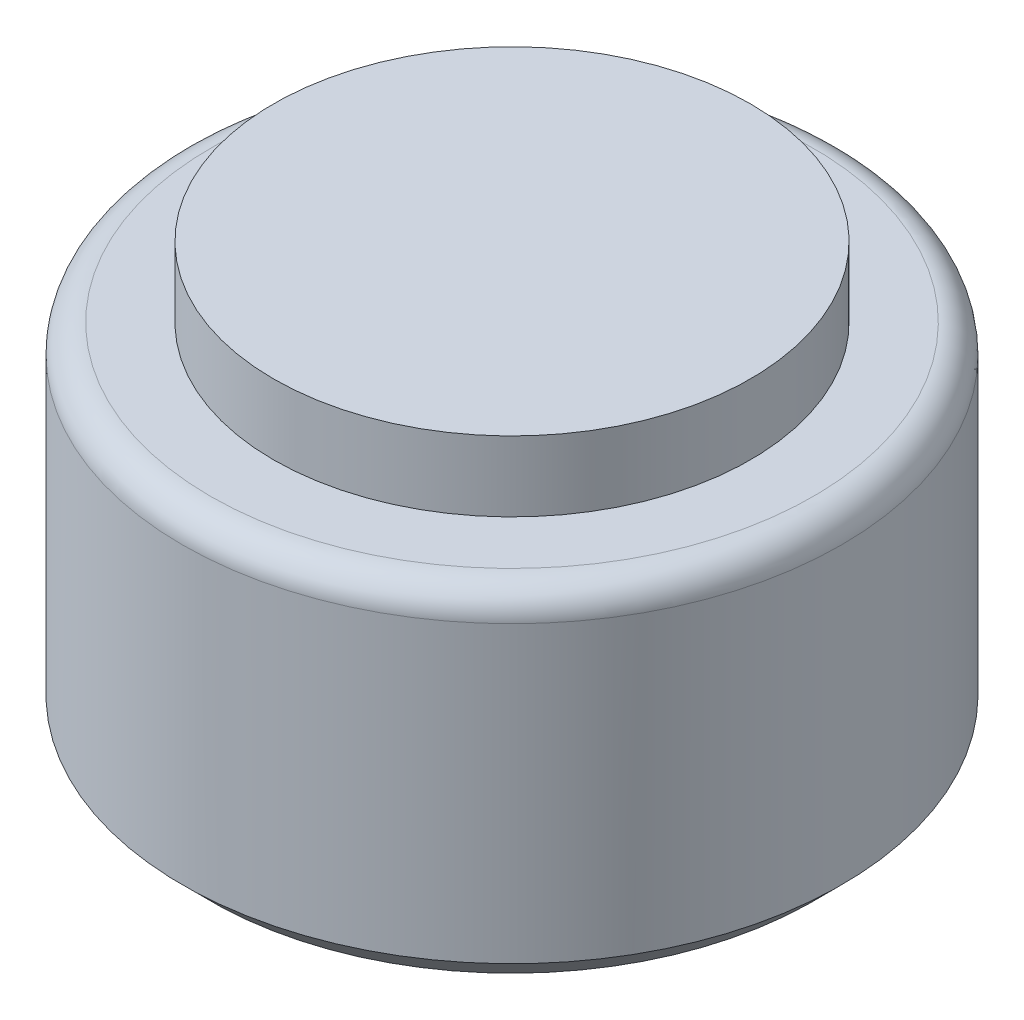
ISO-10303-21;
HEADER;
FILE_DESCRIPTION(('STEP AP214'),'2;1');
FILE_NAME('part.step','',(''),(''),'','','');
FILE_SCHEMA(('AUTOMOTIVE_DESIGN { 1 0 10303 214 1 1 1 1 }'));
ENDSEC;
DATA;
#1=APPLICATION_CONTEXT('core data for automotive mechanical design processes');
#2=APPLICATION_PROTOCOL_DEFINITION('international standard','automotive_design',2000,#1);
#3=PRODUCT_CONTEXT('',#1,'mechanical');
#4=PRODUCT('Part','Part','',(#3));
#5=PRODUCT_RELATED_PRODUCT_CATEGORY('part','',(#4));
#6=PRODUCT_DEFINITION_FORMATION('','',#4);
#7=PRODUCT_DEFINITION_CONTEXT('part definition',#1,'design');
#8=PRODUCT_DEFINITION('design','',#6,#7);
#9=PRODUCT_DEFINITION_SHAPE('','',#8);
#10=(LENGTH_UNIT() NAMED_UNIT(*) SI_UNIT(.MILLI.,.METRE.));
#11=(NAMED_UNIT(*) PLANE_ANGLE_UNIT() SI_UNIT($,.RADIAN.));
#12=(NAMED_UNIT(*) SI_UNIT($,.STERADIAN.) SOLID_ANGLE_UNIT());
#13=UNCERTAINTY_MEASURE_WITH_UNIT(LENGTH_MEASURE(1.E-05),#10,'distance_accuracy_value','');
#14=(GEOMETRIC_REPRESENTATION_CONTEXT(3) GLOBAL_UNCERTAINTY_ASSIGNED_CONTEXT((#13)) GLOBAL_UNIT_ASSIGNED_CONTEXT((#10,
#11,#12)) REPRESENTATION_CONTEXT('',''));
#15=CARTESIAN_POINT('',(0.,0.,0.));
#16=DIRECTION('',(0.,0.,1.));
#17=DIRECTION('',(1.,0.,0.));
#18=AXIS2_PLACEMENT_3D('',#15,#16,#17);
#19=CARTESIAN_POINT('',(0.,0.,0.));
#20=DIRECTION('',(0.,1.,0.));
#21=DIRECTION('',(0.,0.,1.));
#22=AXIS2_PLACEMENT_3D('',#19,#20,#21);
#23=PLANE('',#22);
#24=CARTESIAN_POINT('',(0.,0.,0.));
#25=DIRECTION('',(0.,-1.,0.));
#26=DIRECTION('',(0.,0.,-1.));
#27=AXIS2_PLACEMENT_3D('',#24,#25,#26);
#28=CIRCLE('',#27,85.);
#29=CARTESIAN_POINT('',(0.,0.,-85.));
#30=VERTEX_POINT('',#29);
#31=EDGE_CURVE('E71',#30,#30,#28,.T.);
#32=ORIENTED_EDGE('',*,*,#31,.F.);
#33=EDGE_LOOP('',(#32));
#34=FACE_BOUND('',#33,.T.);
#35=ADVANCED_FACE('F37',(#34),#23,.T.);
#36=CARTESIAN_POINT('',(0.,0.,0.));
#37=DIRECTION('',(0.,-1.,0.));
#38=DIRECTION('',(0.,0.,-1.));
#39=AXIS2_PLACEMENT_3D('',#36,#37,#38);
#40=CYLINDRICAL_SURFACE('',#39,85.);
#41=ORIENTED_EDGE('',*,*,#31,.T.);
#42=EDGE_LOOP('',(#41));
#43=FACE_BOUND('',#42,.T.);
#44=CARTESIAN_POINT('',(0.,-25.,0.));
#45=DIRECTION('',(0.,-1.,0.));
#46=DIRECTION('',(0.,0.,-1.));
#47=AXIS2_PLACEMENT_3D('',#44,#45,#46);
#48=CIRCLE('',#47,85.);
#49=CARTESIAN_POINT('',(0.,-25.,-85.));
#50=VERTEX_POINT('',#49);
#51=EDGE_CURVE('E68',#50,#50,#48,.T.);
#52=ORIENTED_EDGE('',*,*,#51,.F.);
#53=EDGE_LOOP('',(#52));
#54=FACE_BOUND('',#53,.T.);
#55=ADVANCED_FACE('F94',(#43,#54),#40,.T.);
#56=CARTESIAN_POINT('',(85.,-25.,0.));
#57=DIRECTION('',(0.,1.,0.));
#58=DIRECTION('',(0.,0.,1.));
#59=AXIS2_PLACEMENT_3D('',#56,#57,#58);
#60=PLANE('',#59);
#61=CARTESIAN_POINT('',(0.,-25.,0.));
#62=DIRECTION('',(0.,1.,0.));
#63=DIRECTION('',(0.,0.,1.));
#64=AXIS2_PLACEMENT_3D('',#61,#62,#63);
#65=CIRCLE('',#64,107.5);
#66=CARTESIAN_POINT('',(0.,-25.,107.5));
#67=VERTEX_POINT('',#66);
#68=EDGE_CURVE('E11',#67,#67,#65,.T.);
#69=ORIENTED_EDGE('',*,*,#68,.T.);
#70=EDGE_LOOP('',(#69));
#71=FACE_BOUND('',#70,.T.);
#72=ORIENTED_EDGE('',*,*,#51,.T.);
#73=EDGE_LOOP('',(#72));
#74=FACE_BOUND('',#73,.T.);
#75=ADVANCED_FACE('F100',(#71,#74),#60,.T.);
#76=CARTESIAN_POINT('',(0.,0.,0.));
#77=DIRECTION('',(0.,-1.,0.));
#78=DIRECTION('',(0.,0.,-1.));
#79=AXIS2_PLACEMENT_3D('',#76,#77,#78);
#80=CYLINDRICAL_SURFACE('',#79,117.5);
#81=CARTESIAN_POINT('',(0.,-35.,0.));
#82=DIRECTION('',(0.,1.,0.));
#83=DIRECTION('',(0.,0.,1.));
#84=AXIS2_PLACEMENT_3D('',#81,#82,#83);
#85=CIRCLE('',#84,117.5);
#86=CARTESIAN_POINT('',(0.,-35.,117.5));
#87=VERTEX_POINT('',#86);
#88=EDGE_CURVE('E44',#87,#87,#85,.F.);
#89=ORIENTED_EDGE('',*,*,#88,.T.);
#90=EDGE_LOOP('',(#89));
#91=FACE_BOUND('',#90,.T.);
#92=CARTESIAN_POINT('',(0.,-140.,0.));
#93=DIRECTION('',(0.,-1.,0.));
#94=DIRECTION('',(0.,0.,-1.));
#95=AXIS2_PLACEMENT_3D('',#92,#93,#94);
#96=CIRCLE('',#95,117.5);
#97=CARTESIAN_POINT('',(0.,-140.,-117.5));
#98=VERTEX_POINT('',#97);
#99=EDGE_CURVE('E77',#98,#98,#96,.F.);
#100=ORIENTED_EDGE('',*,*,#99,.T.);
#101=EDGE_LOOP('',(#100));
#102=FACE_BOUND('',#101,.T.);
#103=ADVANCED_FACE('F82',(#91,#102),#80,.T.);
#104=CARTESIAN_POINT('',(117.5,-150.,0.));
#105=DIRECTION('',(0.,-1.,0.));
#106=DIRECTION('',(0.,0.,-1.));
#107=AXIS2_PLACEMENT_3D('',#104,#105,#106);
#108=PLANE('',#107);
#109=CARTESIAN_POINT('',(0.,-150.,0.));
#110=DIRECTION('',(0.,-1.,0.));
#111=DIRECTION('',(0.,0.,-1.));
#112=AXIS2_PLACEMENT_3D('',#109,#110,#111);
#113=CIRCLE('',#112,107.5);
#114=CARTESIAN_POINT('',(0.,-150.,-107.5));
#115=VERTEX_POINT('',#114);
#116=EDGE_CURVE('E74',#115,#115,#113,.T.);
#117=ORIENTED_EDGE('',*,*,#116,.T.);
#118=EDGE_LOOP('',(#117));
#119=FACE_BOUND('',#118,.T.);
#120=CARTESIAN_POINT('',(0.,-150.,0.));
#121=DIRECTION('',(0.,-1.,0.));
#122=DIRECTION('',(0.,0.,-1.));
#123=AXIS2_PLACEMENT_3D('',#120,#121,#122);
#124=CIRCLE('',#123,67.5);
#125=CARTESIAN_POINT('',(0.,-150.,-67.5));
#126=VERTEX_POINT('',#125);
#127=EDGE_CURVE('E61',#126,#126,#124,.T.);
#128=ORIENTED_EDGE('',*,*,#127,.F.);
#129=EDGE_LOOP('',(#128));
#130=FACE_BOUND('',#129,.T.);
#131=ADVANCED_FACE('F110',(#119,#130),#108,.T.);
#132=CARTESIAN_POINT('',(0.,0.,0.));
#133=DIRECTION('',(0.,-1.,0.));
#134=DIRECTION('',(0.,0.,-1.));
#135=AXIS2_PLACEMENT_3D('',#132,#133,#134);
#136=CYLINDRICAL_SURFACE('',#135,67.5);
#137=ORIENTED_EDGE('',*,*,#127,.T.);
#138=EDGE_LOOP('',(#137));
#139=FACE_BOUND('',#138,.T.);
#140=CARTESIAN_POINT('',(0.,-110.,0.));
#141=DIRECTION('',(0.,-1.,0.));
#142=DIRECTION('',(0.,0.,-1.));
#143=AXIS2_PLACEMENT_3D('',#140,#141,#142);
#144=CIRCLE('',#143,67.5);
#145=CARTESIAN_POINT('',(0.,-110.,-67.5));
#146=VERTEX_POINT('',#145);
#147=EDGE_CURVE('E57',#146,#146,#144,.T.);
#148=ORIENTED_EDGE('',*,*,#147,.F.);
#149=EDGE_LOOP('',(#148));
#150=FACE_BOUND('',#149,.T.);
#151=ADVANCED_FACE('F113',(#139,#150),#136,.F.);
#152=CARTESIAN_POINT('',(67.5,-110.,0.));
#153=DIRECTION('',(0.,-1.,0.));
#154=DIRECTION('',(0.,0.,-1.));
#155=AXIS2_PLACEMENT_3D('',#152,#153,#154);
#156=PLANE('',#155);
#157=CARTESIAN_POINT('',(0.,-110.,0.));
#158=DIRECTION('',(0.,-1.,0.));
#159=DIRECTION('',(0.,0.,-1.));
#160=AXIS2_PLACEMENT_3D('',#157,#158,#159);
#161=CIRCLE('',#160,6.99999999999999);
#162=CARTESIAN_POINT('',(0.,-110.,-6.99999999999999));
#163=VERTEX_POINT('',#162);
#164=EDGE_CURVE('E58',#163,#163,#161,.T.);
#165=ORIENTED_EDGE('',*,*,#164,.F.);
#166=EDGE_LOOP('',(#165));
#167=FACE_BOUND('',#166,.T.);
#168=ORIENTED_EDGE('',*,*,#147,.T.);
#169=EDGE_LOOP('',(#168));
#170=FACE_BOUND('',#169,.T.);
#171=ADVANCED_FACE('F51',(#167,#170),#156,.T.);
#172=CARTESIAN_POINT('',(0.,-72.,0.));
#173=DIRECTION('',(0.,-1.,0.));
#174=DIRECTION('',(0.,0.,-1.));
#175=AXIS2_PLACEMENT_3D('',#172,#173,#174);
#176=CONICAL_SURFACE('',#175,6.99999999999998,1.02974425867666);
#177=CARTESIAN_POINT('',(0.,-67.7939756668071,0.));
#178=VERTEX_POINT('',#177);
#179=VERTEX_LOOP('',#178);
#180=FACE_BOUND('',#179,.T.);
#181=CARTESIAN_POINT('',(0.,-72.,0.));
#182=DIRECTION('',(0.,-1.,0.));
#183=DIRECTION('',(0.,0.,-1.));
#184=AXIS2_PLACEMENT_3D('',#181,#182,#183);
#185=CIRCLE('',#184,6.99999999999998);
#186=CARTESIAN_POINT('',(0.,-72.,-6.99999999999998));
#187=VERTEX_POINT('',#186);
#188=EDGE_CURVE('E55',#187,#187,#185,.T.);
#189=ORIENTED_EDGE('',*,*,#188,.T.);
#190=EDGE_LOOP('',(#189));
#191=FACE_BOUND('',#190,.T.);
#192=ADVANCED_FACE('F47',(#180,#191),#176,.F.);
#193=CARTESIAN_POINT('',(0.,-110.,0.));
#194=DIRECTION('',(0.,-1.,0.));
#195=DIRECTION('',(0.,0.,-1.));
#196=AXIS2_PLACEMENT_3D('',#193,#194,#195);
#197=CYLINDRICAL_SURFACE('',#196,6.99999999999999);
#198=ORIENTED_EDGE('',*,*,#188,.F.);
#199=EDGE_LOOP('',(#198));
#200=FACE_BOUND('',#199,.T.);
#201=ORIENTED_EDGE('',*,*,#164,.T.);
#202=EDGE_LOOP('',(#201));
#203=FACE_BOUND('',#202,.T.);
#204=ADVANCED_FACE('F50',(#200,#203),#197,.F.);
#205=CARTESIAN_POINT('',(0.,-150.,0.));
#206=DIRECTION('',(0.,1.,0.));
#207=DIRECTION('',(0.,0.,1.));
#208=AXIS2_PLACEMENT_3D('',#205,#206,#207);
#209=CONICAL_SURFACE('',#208,107.5,0.785398163397448);
#210=ORIENTED_EDGE('',*,*,#99,.F.);
#211=EDGE_LOOP('',(#210));
#212=FACE_BOUND('',#211,.T.);
#213=ORIENTED_EDGE('',*,*,#116,.F.);
#214=EDGE_LOOP('',(#213));
#215=FACE_BOUND('',#214,.T.);
#216=ADVANCED_FACE('F86',(#212,#215),#209,.T.);
#217=CARTESIAN_POINT('',(0.,-35.,0.));
#218=DIRECTION('',(0.,1.,0.));
#219=DIRECTION('',(0.,0.,1.));
#220=AXIS2_PLACEMENT_3D('',#217,#218,#219);
#221=TOROIDAL_SURFACE('',#220,107.5,10.);
#222=ORIENTED_EDGE('',*,*,#68,.F.);
#223=EDGE_LOOP('',(#222));
#224=FACE_BOUND('',#223,.T.);
#225=ORIENTED_EDGE('',*,*,#88,.F.);
#226=EDGE_LOOP('',(#225));
#227=FACE_BOUND('',#226,.T.);
#228=ADVANCED_FACE('F39',(#224,#227),#221,.T.);
#229=CLOSED_SHELL('',(#35,#55,#75,#103,#131,#151,#171,#192,#204,#216,#228));
#230=MANIFOLD_SOLID_BREP('B2',#229);
#231=ADVANCED_BREP_SHAPE_REPRESENTATION('',(#18,#230),#14);
#232=SHAPE_DEFINITION_REPRESENTATION(#9,#231);
ENDSEC;
END-ISO-10303-21;
